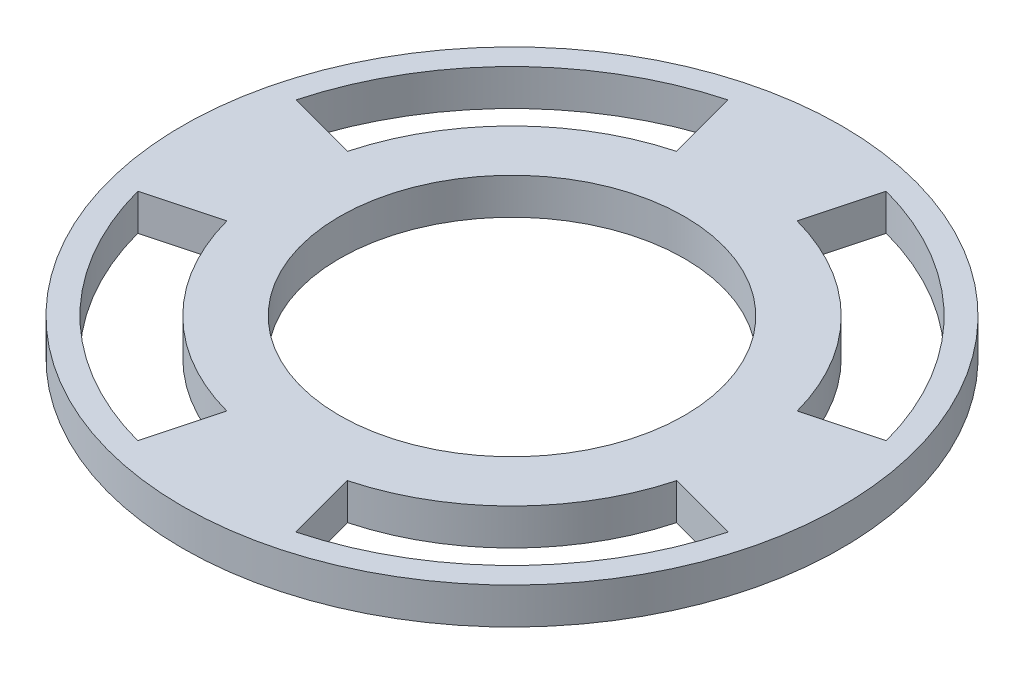
ISO-10303-21;
HEADER;
FILE_DESCRIPTION(('STEP AP214'),'2;1');
FILE_NAME('part.step','',(''),(''),'','','');
FILE_SCHEMA(('AUTOMOTIVE_DESIGN { 1 0 10303 214 1 1 1 1 }'));
ENDSEC;
DATA;
#1=APPLICATION_CONTEXT('core data for automotive mechanical design processes');
#2=APPLICATION_PROTOCOL_DEFINITION('international standard','automotive_design',2000,#1);
#3=PRODUCT_CONTEXT('',#1,'mechanical');
#4=PRODUCT('Part','Part','',(#3));
#5=PRODUCT_RELATED_PRODUCT_CATEGORY('part','',(#4));
#6=PRODUCT_DEFINITION_FORMATION('','',#4);
#7=PRODUCT_DEFINITION_CONTEXT('part definition',#1,'design');
#8=PRODUCT_DEFINITION('design','',#6,#7);
#9=PRODUCT_DEFINITION_SHAPE('','',#8);
#10=(LENGTH_UNIT() NAMED_UNIT(*) SI_UNIT(.MILLI.,.METRE.));
#11=(NAMED_UNIT(*) PLANE_ANGLE_UNIT() SI_UNIT($,.RADIAN.));
#12=(NAMED_UNIT(*) SI_UNIT($,.STERADIAN.) SOLID_ANGLE_UNIT());
#13=UNCERTAINTY_MEASURE_WITH_UNIT(LENGTH_MEASURE(1.E-05),#10,'distance_accuracy_value','');
#14=(GEOMETRIC_REPRESENTATION_CONTEXT(3) GLOBAL_UNCERTAINTY_ASSIGNED_CONTEXT((#13)) GLOBAL_UNIT_ASSIGNED_CONTEXT((#10,
#11,#12)) REPRESENTATION_CONTEXT('',''));
#15=CARTESIAN_POINT('',(0.,0.,0.));
#16=DIRECTION('',(0.,0.,1.));
#17=DIRECTION('',(1.,0.,0.));
#18=AXIS2_PLACEMENT_3D('',#15,#16,#17);
#19=CARTESIAN_POINT('',(0.,2.5,0.));
#20=DIRECTION('',(0.258819045102525,0.,-0.965925826289067));
#21=DIRECTION('',(-0.965925826289067,0.,-0.258819045102525));
#22=AXIS2_PLACEMENT_3D('',#19,#20,#21);
#23=PLANE('',#22);
#24=DIRECTION('',(0.965925826289067,0.,0.258819045102525));
#25=VECTOR('',#24,1.);
#26=CARTESIAN_POINT('',(0.,0.,0.));
#27=LINE('',#26,#25);
#28=CARTESIAN_POINT('',(15.4548132206251,0.,4.1411047216404));
#29=VERTEX_POINT('',#28);
#30=CARTESIAN_POINT('',(20.2844423520704,0.,5.43519994715302));
#31=VERTEX_POINT('',#30);
#32=EDGE_CURVE('E247',#29,#31,#27,.T.);
#33=ORIENTED_EDGE('',*,*,#32,.T.);
#34=DIRECTION('',(0.,-1.,0.));
#35=VECTOR('',#34,1.);
#36=CARTESIAN_POINT('',(20.2844423520704,2.5,5.43519994715302));
#37=LINE('',#36,#35);
#38=CARTESIAN_POINT('',(20.2844423520704,2.5,5.43519994715302));
#39=VERTEX_POINT('',#38);
#40=EDGE_CURVE('E11',#39,#31,#37,.T.);
#41=ORIENTED_EDGE('',*,*,#40,.F.);
#42=DIRECTION('',(0.965925826289067,0.,0.258819045102525));
#43=VECTOR('',#42,1.);
#44=CARTESIAN_POINT('',(0.,2.5,0.));
#45=LINE('',#44,#43);
#46=CARTESIAN_POINT('',(15.4548132206251,2.5,4.1411047216404));
#47=VERTEX_POINT('',#46);
#48=EDGE_CURVE('E180',#47,#39,#45,.T.);
#49=ORIENTED_EDGE('',*,*,#48,.F.);
#50=DIRECTION('',(0.,-1.,0.));
#51=VECTOR('',#50,1.);
#52=CARTESIAN_POINT('',(15.4548132206251,2.5,4.1411047216404));
#53=LINE('',#52,#51);
#54=EDGE_CURVE('E259',#47,#29,#53,.T.);
#55=ORIENTED_EDGE('',*,*,#54,.T.);
#56=EDGE_LOOP('',(#33,#41,#49,#55));
#57=FACE_BOUND('',#56,.T.);
#58=ADVANCED_FACE('F45',(#57),#23,.F.);
#59=CARTESIAN_POINT('',(0.,2.5,0.));
#60=DIRECTION('',(0.,-1.,0.));
#61=DIRECTION('',(0.,0.,-1.));
#62=AXIS2_PLACEMENT_3D('',#59,#60,#61);
#63=CYLINDRICAL_SURFACE('',#62,21.);
#64=CARTESIAN_POINT('',(0.,0.,0.));
#65=DIRECTION('',(0.,1.,0.));
#66=DIRECTION('',(0.,0.,1.));
#67=AXIS2_PLACEMENT_3D('',#64,#65,#66);
#68=CIRCLE('',#67,21.);
#69=CARTESIAN_POINT('',(5.43519994715281,0.,20.2844423520705));
#70=VERTEX_POINT('',#69);
#71=EDGE_CURVE('E170',#70,#31,#68,.T.);
#72=ORIENTED_EDGE('',*,*,#71,.F.);
#73=DIRECTION('',(0.,-1.,0.));
#74=VECTOR('',#73,1.);
#75=CARTESIAN_POINT('',(5.43519994715281,2.5,20.2844423520705));
#76=LINE('',#75,#74);
#77=CARTESIAN_POINT('',(5.43519994715281,2.5,20.2844423520705));
#78=VERTEX_POINT('',#77);
#79=EDGE_CURVE('E56',#78,#70,#76,.T.);
#80=ORIENTED_EDGE('',*,*,#79,.F.);
#81=CARTESIAN_POINT('',(0.,2.5,0.));
#82=DIRECTION('',(0.,1.,0.));
#83=DIRECTION('',(0.,0.,1.));
#84=AXIS2_PLACEMENT_3D('',#81,#82,#83);
#85=CIRCLE('',#84,21.);
#86=EDGE_CURVE('E168',#78,#39,#85,.T.);
#87=ORIENTED_EDGE('',*,*,#86,.T.);
#88=ORIENTED_EDGE('',*,*,#40,.T.);
#89=EDGE_LOOP('',(#72,#80,#87,#88));
#90=FACE_BOUND('',#89,.T.);
#91=ADVANCED_FACE('F167',(#90),#63,.F.);
#92=CARTESIAN_POINT('',(0.,2.5,0.));
#93=DIRECTION('',(0.96592582628907,0.,-0.258819045102515));
#94=DIRECTION('',(-0.258819045102515,0.,-0.96592582628907));
#95=AXIS2_PLACEMENT_3D('',#92,#93,#94);
#96=PLANE('',#95);
#97=DIRECTION('',(0.258819045102515,0.,0.96592582628907));
#98=VECTOR('',#97,1.);
#99=CARTESIAN_POINT('',(0.,0.,0.));
#100=LINE('',#99,#98);
#101=CARTESIAN_POINT('',(4.14110472164024,0.,15.4548132206251));
#102=VERTEX_POINT('',#101);
#103=EDGE_CURVE('E253',#102,#70,#100,.T.);
#104=ORIENTED_EDGE('',*,*,#103,.F.);
#105=DIRECTION('',(0.,-1.,0.));
#106=VECTOR('',#105,1.);
#107=CARTESIAN_POINT('',(4.14110472164024,2.5,15.4548132206251));
#108=LINE('',#107,#106);
#109=CARTESIAN_POINT('',(4.14110472164024,2.5,15.4548132206251));
#110=VERTEX_POINT('',#109);
#111=EDGE_CURVE('E116',#110,#102,#108,.T.);
#112=ORIENTED_EDGE('',*,*,#111,.F.);
#113=DIRECTION('',(0.258819045102515,0.,0.96592582628907));
#114=VECTOR('',#113,1.);
#115=CARTESIAN_POINT('',(0.,2.5,0.));
#116=LINE('',#115,#114);
#117=EDGE_CURVE('E178',#110,#78,#116,.T.);
#118=ORIENTED_EDGE('',*,*,#117,.T.);
#119=ORIENTED_EDGE('',*,*,#79,.T.);
#120=EDGE_LOOP('',(#104,#112,#118,#119));
#121=FACE_BOUND('',#120,.T.);
#122=ADVANCED_FACE('F184',(#121),#96,.T.);
#123=CARTESIAN_POINT('',(0.,2.5,0.));
#124=DIRECTION('',(0.,-1.,0.));
#125=DIRECTION('',(0.,0.,-1.));
#126=AXIS2_PLACEMENT_3D('',#123,#124,#125);
#127=CYLINDRICAL_SURFACE('',#126,21.);
#128=CARTESIAN_POINT('',(0.,0.,0.));
#129=DIRECTION('',(0.,1.,0.));
#130=DIRECTION('',(0.,0.,1.));
#131=AXIS2_PLACEMENT_3D('',#128,#129,#130);
#132=CIRCLE('',#131,21.);
#133=CARTESIAN_POINT('',(-20.2844423520705,0.,5.43519994715274));
#134=VERTEX_POINT('',#133);
#135=CARTESIAN_POINT('',(-5.43519994715309,0.,20.2844423520704));
#136=VERTEX_POINT('',#135);
#137=EDGE_CURVE('E227',#134,#136,#132,.T.);
#138=ORIENTED_EDGE('',*,*,#137,.F.);
#139=DIRECTION('',(0.,-1.,0.));
#140=VECTOR('',#139,1.);
#141=CARTESIAN_POINT('',(-20.2844423520705,2.5,5.43519994715274));
#142=LINE('',#141,#140);
#143=CARTESIAN_POINT('',(-20.2844423520705,2.5,5.43519994715274));
#144=VERTEX_POINT('',#143);
#145=EDGE_CURVE('E262',#144,#134,#142,.T.);
#146=ORIENTED_EDGE('',*,*,#145,.F.);
#147=CARTESIAN_POINT('',(0.,2.5,0.));
#148=DIRECTION('',(0.,1.,0.));
#149=DIRECTION('',(0.,0.,1.));
#150=AXIS2_PLACEMENT_3D('',#147,#148,#149);
#151=CIRCLE('',#150,21.);
#152=CARTESIAN_POINT('',(-5.43519994715309,2.5,20.2844423520704));
#153=VERTEX_POINT('',#152);
#154=EDGE_CURVE('E344',#144,#153,#151,.T.);
#155=ORIENTED_EDGE('',*,*,#154,.T.);
#156=DIRECTION('',(0.,-1.,0.));
#157=VECTOR('',#156,1.);
#158=CARTESIAN_POINT('',(-5.43519994715309,2.5,20.2844423520704));
#159=LINE('',#158,#157);
#160=EDGE_CURVE('E265',#153,#136,#159,.T.);
#161=ORIENTED_EDGE('',*,*,#160,.T.);
#162=EDGE_LOOP('',(#138,#146,#155,#161));
#163=FACE_BOUND('',#162,.T.);
#164=ADVANCED_FACE('F404',(#163),#127,.F.);
#165=CARTESIAN_POINT('',(0.,2.5,0.));
#166=DIRECTION('',(0.258819045102511,0.,0.965925826289071));
#167=DIRECTION('',(0.965925826289071,0.,-0.258819045102511));
#168=AXIS2_PLACEMENT_3D('',#165,#166,#167);
#169=PLANE('',#168);
#170=DIRECTION('',(-0.965925826289071,0.,0.258819045102511));
#171=VECTOR('',#170,1.);
#172=CARTESIAN_POINT('',(0.,0.,0.));
#173=LINE('',#172,#171);
#174=CARTESIAN_POINT('',(-15.4548132206251,0.,4.14110472164018));
#175=VERTEX_POINT('',#174);
#176=EDGE_CURVE('E231',#175,#134,#173,.T.);
#177=ORIENTED_EDGE('',*,*,#176,.F.);
#178=DIRECTION('',(0.,-1.,0.));
#179=VECTOR('',#178,1.);
#180=CARTESIAN_POINT('',(-15.4548132206251,2.5,4.14110472164018));
#181=LINE('',#180,#179);
#182=CARTESIAN_POINT('',(-15.4548132206251,2.5,4.14110472164018));
#183=VERTEX_POINT('',#182);
#184=EDGE_CURVE('E273',#183,#175,#181,.T.);
#185=ORIENTED_EDGE('',*,*,#184,.F.);
#186=DIRECTION('',(-0.965925826289071,0.,0.258819045102511));
#187=VECTOR('',#186,1.);
#188=CARTESIAN_POINT('',(0.,2.5,0.));
#189=LINE('',#188,#187);
#190=EDGE_CURVE('E348',#183,#144,#189,.T.);
#191=ORIENTED_EDGE('',*,*,#190,.T.);
#192=ORIENTED_EDGE('',*,*,#145,.T.);
#193=EDGE_LOOP('',(#177,#185,#191,#192));
#194=FACE_BOUND('',#193,.T.);
#195=ADVANCED_FACE('F400',(#194),#169,.T.);
#196=CARTESIAN_POINT('',(0.,2.5,0.));
#197=DIRECTION('',(0.,-1.,0.));
#198=DIRECTION('',(0.,0.,-1.));
#199=AXIS2_PLACEMENT_3D('',#196,#197,#198);
#200=CYLINDRICAL_SURFACE('',#199,16.);
#201=CARTESIAN_POINT('',(0.,0.,0.));
#202=DIRECTION('',(0.,1.,0.));
#203=DIRECTION('',(0.,0.,1.));
#204=AXIS2_PLACEMENT_3D('',#201,#202,#203);
#205=CIRCLE('',#204,16.);
#206=CARTESIAN_POINT('',(-4.14110472164045,0.,15.4548132206251));
#207=VERTEX_POINT('',#206);
#208=EDGE_CURVE('E235',#175,#207,#205,.T.);
#209=ORIENTED_EDGE('',*,*,#208,.T.);
#210=DIRECTION('',(0.,-1.,0.));
#211=VECTOR('',#210,1.);
#212=CARTESIAN_POINT('',(-4.14110472164045,2.5,15.4548132206251));
#213=LINE('',#212,#211);
#214=CARTESIAN_POINT('',(-4.14110472164045,2.5,15.4548132206251));
#215=VERTEX_POINT('',#214);
#216=EDGE_CURVE('E268',#215,#207,#213,.T.);
#217=ORIENTED_EDGE('',*,*,#216,.F.);
#218=CARTESIAN_POINT('',(0.,2.5,0.));
#219=DIRECTION('',(0.,1.,0.));
#220=DIRECTION('',(0.,0.,1.));
#221=AXIS2_PLACEMENT_3D('',#218,#219,#220);
#222=CIRCLE('',#221,16.);
#223=EDGE_CURVE('E352',#183,#215,#222,.T.);
#224=ORIENTED_EDGE('',*,*,#223,.F.);
#225=ORIENTED_EDGE('',*,*,#184,.T.);
#226=EDGE_LOOP('',(#209,#217,#224,#225));
#227=FACE_BOUND('',#226,.T.);
#228=ADVANCED_FACE('F396',(#227),#200,.T.);
#229=CARTESIAN_POINT('',(0.,2.5,0.));
#230=DIRECTION('',(-0.965925826289068,0.,-0.258819045102521));
#231=DIRECTION('',(-0.258819045102521,0.,0.965925826289068));
#232=AXIS2_PLACEMENT_3D('',#229,#230,#231);
#233=PLANE('',#232);
#234=DIRECTION('',(0.258819045102521,0.,-0.965925826289068));
#235=VECTOR('',#234,1.);
#236=CARTESIAN_POINT('',(0.,0.,0.));
#237=LINE('',#236,#235);
#238=CARTESIAN_POINT('',(4.14110472164034,0.,-15.4548132206251));
#239=VERTEX_POINT('',#238);
#240=CARTESIAN_POINT('',(5.43519994715295,0.,-20.2844423520704));
#241=VERTEX_POINT('',#240);
#242=EDGE_CURVE('E212',#239,#241,#237,.T.);
#243=ORIENTED_EDGE('',*,*,#242,.T.);
#244=DIRECTION('',(0.,-1.,0.));
#245=VECTOR('',#244,1.);
#246=CARTESIAN_POINT('',(5.43519994715295,2.5,-20.2844423520704));
#247=LINE('',#246,#245);
#248=CARTESIAN_POINT('',(5.43519994715295,2.5,-20.2844423520704));
#249=VERTEX_POINT('',#248);
#250=EDGE_CURVE('E269',#249,#241,#247,.T.);
#251=ORIENTED_EDGE('',*,*,#250,.F.);
#252=DIRECTION('',(0.258819045102521,0.,-0.965925826289068));
#253=VECTOR('',#252,1.);
#254=CARTESIAN_POINT('',(0.,2.5,0.));
#255=LINE('',#254,#253);
#256=CARTESIAN_POINT('',(4.14110472164034,2.5,-15.4548132206251));
#257=VERTEX_POINT('',#256);
#258=EDGE_CURVE('E321',#257,#249,#255,.T.);
#259=ORIENTED_EDGE('',*,*,#258,.F.);
#260=DIRECTION('',(0.,-1.,0.));
#261=VECTOR('',#260,1.);
#262=CARTESIAN_POINT('',(4.14110472164034,2.5,-15.4548132206251));
#263=LINE('',#262,#261);
#264=EDGE_CURVE('E278',#257,#239,#263,.T.);
#265=ORIENTED_EDGE('',*,*,#264,.T.);
#266=EDGE_LOOP('',(#243,#251,#259,#265));
#267=FACE_BOUND('',#266,.T.);
#268=ADVANCED_FACE('F399',(#267),#233,.F.);
#269=CARTESIAN_POINT('',(0.,2.5,0.));
#270=DIRECTION('',(0.,-1.,0.));
#271=DIRECTION('',(0.,0.,-1.));
#272=AXIS2_PLACEMENT_3D('',#269,#270,#271);
#273=CYLINDRICAL_SURFACE('',#272,21.);
#274=CARTESIAN_POINT('',(0.,0.,0.));
#275=DIRECTION('',(0.,1.,0.));
#276=DIRECTION('',(0.,0.,1.));
#277=AXIS2_PLACEMENT_3D('',#274,#275,#276);
#278=CIRCLE('',#277,21.);
#279=CARTESIAN_POINT('',(20.2844423520704,0.,-5.43519994715288));
#280=VERTEX_POINT('',#279);
#281=EDGE_CURVE('E216',#280,#241,#278,.T.);
#282=ORIENTED_EDGE('',*,*,#281,.F.);
#283=DIRECTION('',(0.,-1.,0.));
#284=VECTOR('',#283,1.);
#285=CARTESIAN_POINT('',(20.2844423520704,2.5,-5.43519994715288));
#286=LINE('',#285,#284);
#287=CARTESIAN_POINT('',(20.2844423520704,2.5,-5.43519994715288));
#288=VERTEX_POINT('',#287);
#289=EDGE_CURVE('E285',#288,#280,#286,.T.);
#290=ORIENTED_EDGE('',*,*,#289,.F.);
#291=CARTESIAN_POINT('',(0.,2.5,0.));
#292=DIRECTION('',(0.,1.,0.));
#293=DIRECTION('',(0.,0.,1.));
#294=AXIS2_PLACEMENT_3D('',#291,#292,#293);
#295=CIRCLE('',#294,21.);
#296=EDGE_CURVE('E333',#288,#249,#295,.T.);
#297=ORIENTED_EDGE('',*,*,#296,.T.);
#298=ORIENTED_EDGE('',*,*,#250,.T.);
#299=EDGE_LOOP('',(#282,#290,#297,#298));
#300=FACE_BOUND('',#299,.T.);
#301=ADVANCED_FACE('F415',(#300),#273,.F.);
#302=CARTESIAN_POINT('',(0.,2.5,0.));
#303=DIRECTION('',(-0.258819045102518,0.,-0.965925826289069));
#304=DIRECTION('',(-0.965925826289069,0.,0.258819045102518));
#305=AXIS2_PLACEMENT_3D('',#302,#303,#304);
#306=PLANE('',#305);
#307=DIRECTION('',(0.965925826289069,0.,-0.258819045102518));
#308=VECTOR('',#307,1.);
#309=CARTESIAN_POINT('',(0.,0.,0.));
#310=LINE('',#309,#308);
#311=CARTESIAN_POINT('',(15.4548132206251,0.,-4.14110472164029));
#312=VERTEX_POINT('',#311);
#313=EDGE_CURVE('E220',#312,#280,#310,.T.);
#314=ORIENTED_EDGE('',*,*,#313,.F.);
#315=DIRECTION('',(0.,-1.,0.));
#316=VECTOR('',#315,1.);
#317=CARTESIAN_POINT('',(15.4548132206251,2.5,-4.14110472164029));
#318=LINE('',#317,#316);
#319=CARTESIAN_POINT('',(15.4548132206251,2.5,-4.14110472164029));
#320=VERTEX_POINT('',#319);
#321=EDGE_CURVE('E282',#320,#312,#318,.T.);
#322=ORIENTED_EDGE('',*,*,#321,.F.);
#323=DIRECTION('',(0.965925826289069,0.,-0.258819045102518));
#324=VECTOR('',#323,1.);
#325=CARTESIAN_POINT('',(0.,2.5,0.));
#326=LINE('',#325,#324);
#327=EDGE_CURVE('E337',#320,#288,#326,.T.);
#328=ORIENTED_EDGE('',*,*,#327,.T.);
#329=ORIENTED_EDGE('',*,*,#289,.T.);
#330=EDGE_LOOP('',(#314,#322,#328,#329));
#331=FACE_BOUND('',#330,.T.);
#332=ADVANCED_FACE('F412',(#331),#306,.T.);
#333=CARTESIAN_POINT('',(0.,2.5,0.));
#334=DIRECTION('',(0.,-1.,0.));
#335=DIRECTION('',(0.,0.,-1.));
#336=AXIS2_PLACEMENT_3D('',#333,#334,#335);
#337=CYLINDRICAL_SURFACE('',#336,21.);
#338=CARTESIAN_POINT('',(0.,0.,0.));
#339=DIRECTION('',(0.,1.,0.));
#340=DIRECTION('',(0.,0.,1.));
#341=AXIS2_PLACEMENT_3D('',#338,#339,#340);
#342=CIRCLE('',#341,21.);
#343=CARTESIAN_POINT('',(-5.43519994715295,0.,-20.2844423520704));
#344=VERTEX_POINT('',#343);
#345=CARTESIAN_POINT('',(-20.2844423520704,0.,-5.43519994715316));
#346=VERTEX_POINT('',#345);
#347=EDGE_CURVE('E196',#344,#346,#342,.T.);
#348=ORIENTED_EDGE('',*,*,#347,.F.);
#349=DIRECTION('',(0.,-1.,0.));
#350=VECTOR('',#349,1.);
#351=CARTESIAN_POINT('',(-5.43519994715295,2.5,-20.2844423520704));
#352=LINE('',#351,#350);
#353=CARTESIAN_POINT('',(-5.43519994715295,2.5,-20.2844423520704));
#354=VERTEX_POINT('',#353);
#355=EDGE_CURVE('E49',#354,#344,#352,.T.);
#356=ORIENTED_EDGE('',*,*,#355,.F.);
#357=CARTESIAN_POINT('',(0.,2.5,0.));
#358=DIRECTION('',(0.,1.,0.));
#359=DIRECTION('',(0.,0.,1.));
#360=AXIS2_PLACEMENT_3D('',#357,#358,#359);
#361=CIRCLE('',#360,21.);
#362=CARTESIAN_POINT('',(-20.2844423520704,2.5,-5.43519994715316));
#363=VERTEX_POINT('',#362);
#364=EDGE_CURVE('E327',#354,#363,#361,.T.);
#365=ORIENTED_EDGE('',*,*,#364,.T.);
#366=DIRECTION('',(0.,-1.,0.));
#367=VECTOR('',#366,1.);
#368=CARTESIAN_POINT('',(-20.2844423520704,2.5,-5.43519994715316));
#369=LINE('',#368,#367);
#370=EDGE_CURVE('E188',#363,#346,#369,.T.);
#371=ORIENTED_EDGE('',*,*,#370,.T.);
#372=EDGE_LOOP('',(#348,#356,#365,#371));
#373=FACE_BOUND('',#372,.T.);
#374=ADVANCED_FACE('F307',(#373),#337,.F.);
#375=CARTESIAN_POINT('',(0.,2.5,0.));
#376=DIRECTION('',(-0.965925826289068,0.,0.258819045102522));
#377=DIRECTION('',(0.258819045102522,0.,0.965925826289068));
#378=AXIS2_PLACEMENT_3D('',#375,#376,#377);
#379=PLANE('',#378);
#380=DIRECTION('',(-0.258819045102522,0.,-0.965925826289068));
#381=VECTOR('',#380,1.);
#382=CARTESIAN_POINT('',(0.,0.,0.));
#383=LINE('',#382,#381);
#384=CARTESIAN_POINT('',(-4.14110472164034,0.,-15.4548132206251));
#385=VERTEX_POINT('',#384);
#386=EDGE_CURVE('E200',#385,#344,#383,.T.);
#387=ORIENTED_EDGE('',*,*,#386,.F.);
#388=DIRECTION('',(0.,-1.,0.));
#389=VECTOR('',#388,1.);
#390=CARTESIAN_POINT('',(-4.14110472164034,2.5,-15.4548132206251));
#391=LINE('',#390,#389);
#392=CARTESIAN_POINT('',(-4.14110472164034,2.5,-15.4548132206251));
#393=VERTEX_POINT('',#392);
#394=EDGE_CURVE('E295',#393,#385,#391,.T.);
#395=ORIENTED_EDGE('',*,*,#394,.F.);
#396=DIRECTION('',(-0.258819045102522,0.,-0.965925826289068));
#397=VECTOR('',#396,1.);
#398=CARTESIAN_POINT('',(0.,2.5,0.));
#399=LINE('',#398,#397);
#400=EDGE_CURVE('E306',#393,#354,#399,.T.);
#401=ORIENTED_EDGE('',*,*,#400,.T.);
#402=ORIENTED_EDGE('',*,*,#355,.T.);
#403=EDGE_LOOP('',(#387,#395,#401,#402));
#404=FACE_BOUND('',#403,.T.);
#405=ADVANCED_FACE('F304',(#404),#379,.T.);
#406=CARTESIAN_POINT('',(0.,2.5,0.));
#407=DIRECTION('',(0.,-1.,0.));
#408=DIRECTION('',(0.,0.,-1.));
#409=AXIS2_PLACEMENT_3D('',#406,#407,#408);
#410=CYLINDRICAL_SURFACE('',#409,16.);
#411=CARTESIAN_POINT('',(0.,0.,0.));
#412=DIRECTION('',(0.,1.,0.));
#413=DIRECTION('',(0.,0.,1.));
#414=AXIS2_PLACEMENT_3D('',#411,#412,#413);
#415=CIRCLE('',#414,16.);
#416=CARTESIAN_POINT('',(-15.454813220625,0.,-4.1411047216405));
#417=VERTEX_POINT('',#416);
#418=EDGE_CURVE('E204',#385,#417,#415,.T.);
#419=ORIENTED_EDGE('',*,*,#418,.T.);
#420=DIRECTION('',(0.,-1.,0.));
#421=VECTOR('',#420,1.);
#422=CARTESIAN_POINT('',(-15.454813220625,2.5,-4.1411047216405));
#423=LINE('',#422,#421);
#424=CARTESIAN_POINT('',(-15.454813220625,2.5,-4.1411047216405));
#425=VERTEX_POINT('',#424);
#426=EDGE_CURVE('E292',#425,#417,#423,.T.);
#427=ORIENTED_EDGE('',*,*,#426,.F.);
#428=CARTESIAN_POINT('',(0.,2.5,0.));
#429=DIRECTION('',(0.,1.,0.));
#430=DIRECTION('',(0.,0.,1.));
#431=AXIS2_PLACEMENT_3D('',#428,#429,#430);
#432=CIRCLE('',#431,16.);
#433=EDGE_CURVE('E315',#393,#425,#432,.T.);
#434=ORIENTED_EDGE('',*,*,#433,.F.);
#435=ORIENTED_EDGE('',*,*,#394,.T.);
#436=EDGE_LOOP('',(#419,#427,#434,#435));
#437=FACE_BOUND('',#436,.T.);
#438=ADVANCED_FACE('F313',(#437),#410,.T.);
#439=CARTESIAN_POINT('',(0.,2.5,0.));
#440=DIRECTION('',(0.,-1.,0.));
#441=DIRECTION('',(0.,0.,-1.));
#442=AXIS2_PLACEMENT_3D('',#439,#440,#441);
#443=CYLINDRICAL_SURFACE('',#442,11.85);
#444=CARTESIAN_POINT('',(0.,2.5,0.));
#445=DIRECTION('',(0.,1.,0.));
#446=DIRECTION('',(0.,0.,1.));
#447=AXIS2_PLACEMENT_3D('',#444,#445,#446);
#448=CIRCLE('',#447,11.85);
#449=CARTESIAN_POINT('',(0.,2.5,11.85));
#450=VERTEX_POINT('',#449);
#451=EDGE_CURVE('E359',#450,#450,#448,.T.);
#452=ORIENTED_EDGE('',*,*,#451,.T.);
#453=EDGE_LOOP('',(#452));
#454=FACE_BOUND('',#453,.T.);
#455=CARTESIAN_POINT('',(0.,0.,0.));
#456=DIRECTION('',(0.,1.,0.));
#457=DIRECTION('',(0.,0.,1.));
#458=AXIS2_PLACEMENT_3D('',#455,#456,#457);
#459=CIRCLE('',#458,11.85);
#460=CARTESIAN_POINT('',(0.,0.,11.85));
#461=VERTEX_POINT('',#460);
#462=EDGE_CURVE('E243',#461,#461,#459,.T.);
#463=ORIENTED_EDGE('',*,*,#462,.F.);
#464=EDGE_LOOP('',(#463));
#465=FACE_BOUND('',#464,.T.);
#466=ADVANCED_FACE('F365',(#454,#465),#443,.F.);
#467=CARTESIAN_POINT('',(0.,2.5,0.));
#468=DIRECTION('',(0.965925826289066,0.,0.258819045102528));
#469=DIRECTION('',(0.258819045102528,0.,-0.965925826289066));
#470=AXIS2_PLACEMENT_3D('',#467,#468,#469);
#471=PLANE('',#470);
#472=DIRECTION('',(-0.258819045102528,0.,0.965925826289066));
#473=VECTOR('',#472,1.);
#474=CARTESIAN_POINT('',(0.,0.,0.));
#475=LINE('',#474,#473);
#476=EDGE_CURVE('E239',#207,#136,#475,.T.);
#477=ORIENTED_EDGE('',*,*,#476,.T.);
#478=ORIENTED_EDGE('',*,*,#160,.F.);
#479=DIRECTION('',(-0.258819045102528,0.,0.965925826289066));
#480=VECTOR('',#479,1.);
#481=CARTESIAN_POINT('',(0.,2.5,0.));
#482=LINE('',#481,#480);
#483=EDGE_CURVE('E356',#215,#153,#482,.T.);
#484=ORIENTED_EDGE('',*,*,#483,.F.);
#485=ORIENTED_EDGE('',*,*,#216,.T.);
#486=EDGE_LOOP('',(#477,#478,#484,#485));
#487=FACE_BOUND('',#486,.T.);
#488=ADVANCED_FACE('F391',(#487),#471,.F.);
#489=CARTESIAN_POINT('',(0.,2.5,0.));
#490=DIRECTION('',(0.,-1.,0.));
#491=DIRECTION('',(0.,0.,-1.));
#492=AXIS2_PLACEMENT_3D('',#489,#490,#491);
#493=CYLINDRICAL_SURFACE('',#492,16.);
#494=CARTESIAN_POINT('',(0.,0.,0.));
#495=DIRECTION('',(0.,1.,0.));
#496=DIRECTION('',(0.,0.,1.));
#497=AXIS2_PLACEMENT_3D('',#494,#495,#496);
#498=CIRCLE('',#497,16.);
#499=EDGE_CURVE('E224',#312,#239,#498,.T.);
#500=ORIENTED_EDGE('',*,*,#499,.T.);
#501=ORIENTED_EDGE('',*,*,#264,.F.);
#502=CARTESIAN_POINT('',(0.,2.5,0.));
#503=DIRECTION('',(0.,1.,0.));
#504=DIRECTION('',(0.,0.,1.));
#505=AXIS2_PLACEMENT_3D('',#502,#503,#504);
#506=CIRCLE('',#505,16.);
#507=EDGE_CURVE('E341',#320,#257,#506,.T.);
#508=ORIENTED_EDGE('',*,*,#507,.F.);
#509=ORIENTED_EDGE('',*,*,#321,.T.);
#510=EDGE_LOOP('',(#500,#501,#508,#509));
#511=FACE_BOUND('',#510,.T.);
#512=ADVANCED_FACE('F394',(#511),#493,.T.);
#513=CARTESIAN_POINT('',(0.,2.5,0.));
#514=DIRECTION('',(-0.258819045102531,0.,0.965925826289065));
#515=DIRECTION('',(0.965925826289065,0.,0.258819045102531));
#516=AXIS2_PLACEMENT_3D('',#513,#514,#515);
#517=PLANE('',#516);
#518=DIRECTION('',(-0.965925826289065,0.,-0.258819045102531));
#519=VECTOR('',#518,1.);
#520=CARTESIAN_POINT('',(0.,0.,0.));
#521=LINE('',#520,#519);
#522=EDGE_CURVE('E208',#417,#346,#521,.T.);
#523=ORIENTED_EDGE('',*,*,#522,.T.);
#524=ORIENTED_EDGE('',*,*,#370,.F.);
#525=DIRECTION('',(-0.965925826289065,0.,-0.258819045102531));
#526=VECTOR('',#525,1.);
#527=CARTESIAN_POINT('',(0.,2.5,0.));
#528=LINE('',#527,#526);
#529=EDGE_CURVE('E318',#425,#363,#528,.T.);
#530=ORIENTED_EDGE('',*,*,#529,.F.);
#531=ORIENTED_EDGE('',*,*,#426,.T.);
#532=EDGE_LOOP('',(#523,#524,#530,#531));
#533=FACE_BOUND('',#532,.T.);
#534=ADVANCED_FACE('F317',(#533),#517,.F.);
#535=CARTESIAN_POINT('',(0.,2.5,0.));
#536=DIRECTION('',(0.,-1.,0.));
#537=DIRECTION('',(0.,0.,-1.));
#538=AXIS2_PLACEMENT_3D('',#535,#536,#537);
#539=CYLINDRICAL_SURFACE('',#538,22.65);
#540=CARTESIAN_POINT('',(0.,2.5,0.));
#541=DIRECTION('',(0.,1.,0.));
#542=DIRECTION('',(0.,0.,1.));
#543=AXIS2_PLACEMENT_3D('',#540,#541,#542);
#544=CIRCLE('',#543,22.65);
#545=CARTESIAN_POINT('',(0.,2.5,22.65));
#546=VERTEX_POINT('',#545);
#547=EDGE_CURVE('E258',#546,#546,#544,.T.);
#548=ORIENTED_EDGE('',*,*,#547,.F.);
#549=EDGE_LOOP('',(#548));
#550=FACE_BOUND('',#549,.T.);
#551=CARTESIAN_POINT('',(0.,0.,0.));
#552=DIRECTION('',(0.,1.,0.));
#553=DIRECTION('',(0.,0.,1.));
#554=AXIS2_PLACEMENT_3D('',#551,#552,#553);
#555=CIRCLE('',#554,22.65);
#556=CARTESIAN_POINT('',(0.,0.,22.65));
#557=VERTEX_POINT('',#556);
#558=EDGE_CURVE('E192',#557,#557,#555,.T.);
#559=ORIENTED_EDGE('',*,*,#558,.T.);
#560=EDGE_LOOP('',(#559));
#561=FACE_BOUND('',#560,.T.);
#562=ADVANCED_FACE('F47',(#550,#561),#539,.T.);
#563=CARTESIAN_POINT('',(0.,2.5,0.));
#564=DIRECTION('',(0.,-1.,0.));
#565=DIRECTION('',(0.,0.,-1.));
#566=AXIS2_PLACEMENT_3D('',#563,#564,#565);
#567=CYLINDRICAL_SURFACE('',#566,16.);
#568=CARTESIAN_POINT('',(0.,0.,0.));
#569=DIRECTION('',(0.,1.,0.));
#570=DIRECTION('',(0.,0.,1.));
#571=AXIS2_PLACEMENT_3D('',#568,#569,#570);
#572=CIRCLE('',#571,16.);
#573=EDGE_CURVE('E119',#102,#29,#572,.T.);
#574=ORIENTED_EDGE('',*,*,#573,.T.);
#575=ORIENTED_EDGE('',*,*,#54,.F.);
#576=CARTESIAN_POINT('',(0.,2.5,0.));
#577=DIRECTION('',(0.,1.,0.));
#578=DIRECTION('',(0.,0.,1.));
#579=AXIS2_PLACEMENT_3D('',#576,#577,#578);
#580=CIRCLE('',#579,16.);
#581=EDGE_CURVE('E65',#110,#47,#580,.T.);
#582=ORIENTED_EDGE('',*,*,#581,.F.);
#583=ORIENTED_EDGE('',*,*,#111,.T.);
#584=EDGE_LOOP('',(#574,#575,#582,#583));
#585=FACE_BOUND('',#584,.T.);
#586=ADVANCED_FACE('F369',(#585),#567,.T.);
#587=CARTESIAN_POINT('',(0.,2.5,0.));
#588=DIRECTION('',(0.,1.,0.));
#589=DIRECTION('',(0.,0.,1.));
#590=AXIS2_PLACEMENT_3D('',#587,#588,#589);
#591=PLANE('',#590);
#592=ORIENTED_EDGE('',*,*,#547,.T.);
#593=EDGE_LOOP('',(#592));
#594=FACE_BOUND('',#593,.T.);
#595=ORIENTED_EDGE('',*,*,#364,.F.);
#596=ORIENTED_EDGE('',*,*,#400,.F.);
#597=ORIENTED_EDGE('',*,*,#433,.T.);
#598=ORIENTED_EDGE('',*,*,#529,.T.);
#599=EDGE_LOOP('',(#595,#596,#597,#598));
#600=FACE_BOUND('',#599,.T.);
#601=ORIENTED_EDGE('',*,*,#258,.T.);
#602=ORIENTED_EDGE('',*,*,#296,.F.);
#603=ORIENTED_EDGE('',*,*,#327,.F.);
#604=ORIENTED_EDGE('',*,*,#507,.T.);
#605=EDGE_LOOP('',(#601,#602,#603,#604));
#606=FACE_BOUND('',#605,.T.);
#607=ORIENTED_EDGE('',*,*,#154,.F.);
#608=ORIENTED_EDGE('',*,*,#190,.F.);
#609=ORIENTED_EDGE('',*,*,#223,.T.);
#610=ORIENTED_EDGE('',*,*,#483,.T.);
#611=EDGE_LOOP('',(#607,#608,#609,#610));
#612=FACE_BOUND('',#611,.T.);
#613=ORIENTED_EDGE('',*,*,#451,.F.);
#614=EDGE_LOOP('',(#613));
#615=FACE_BOUND('',#614,.T.);
#616=ORIENTED_EDGE('',*,*,#48,.T.);
#617=ORIENTED_EDGE('',*,*,#86,.F.);
#618=ORIENTED_EDGE('',*,*,#117,.F.);
#619=ORIENTED_EDGE('',*,*,#581,.T.);
#620=EDGE_LOOP('',(#616,#617,#618,#619));
#621=FACE_BOUND('',#620,.T.);
#622=ADVANCED_FACE('F177',(#594,#600,#606,#612,#615,#621),#591,.T.);
#623=CARTESIAN_POINT('',(0.,0.,0.));
#624=DIRECTION('',(0.,1.,0.));
#625=DIRECTION('',(0.,0.,1.));
#626=AXIS2_PLACEMENT_3D('',#623,#624,#625);
#627=PLANE('',#626);
#628=ORIENTED_EDGE('',*,*,#558,.F.);
#629=EDGE_LOOP('',(#628));
#630=FACE_BOUND('',#629,.T.);
#631=ORIENTED_EDGE('',*,*,#347,.T.);
#632=ORIENTED_EDGE('',*,*,#522,.F.);
#633=ORIENTED_EDGE('',*,*,#418,.F.);
#634=ORIENTED_EDGE('',*,*,#386,.T.);
#635=EDGE_LOOP('',(#631,#632,#633,#634));
#636=FACE_BOUND('',#635,.T.);
#637=ORIENTED_EDGE('',*,*,#242,.F.);
#638=ORIENTED_EDGE('',*,*,#499,.F.);
#639=ORIENTED_EDGE('',*,*,#313,.T.);
#640=ORIENTED_EDGE('',*,*,#281,.T.);
#641=EDGE_LOOP('',(#637,#638,#639,#640));
#642=FACE_BOUND('',#641,.T.);
#643=ORIENTED_EDGE('',*,*,#137,.T.);
#644=ORIENTED_EDGE('',*,*,#476,.F.);
#645=ORIENTED_EDGE('',*,*,#208,.F.);
#646=ORIENTED_EDGE('',*,*,#176,.T.);
#647=EDGE_LOOP('',(#643,#644,#645,#646));
#648=FACE_BOUND('',#647,.T.);
#649=ORIENTED_EDGE('',*,*,#462,.T.);
#650=EDGE_LOOP('',(#649));
#651=FACE_BOUND('',#650,.T.);
#652=ORIENTED_EDGE('',*,*,#32,.F.);
#653=ORIENTED_EDGE('',*,*,#573,.F.);
#654=ORIENTED_EDGE('',*,*,#103,.T.);
#655=ORIENTED_EDGE('',*,*,#71,.T.);
#656=EDGE_LOOP('',(#652,#653,#654,#655));
#657=FACE_BOUND('',#656,.T.);
#658=ADVANCED_FACE('F310',(#630,#636,#642,#648,#651,#657),#627,.F.);
#659=CLOSED_SHELL('',(#58,#91,#122,#164,#195,#228,#268,#301,#332,#374,#405,#438,#466,#488,#512,
#534,#562,#586,#622,#658));
#660=MANIFOLD_SOLID_BREP('B2',#659);
#661=ADVANCED_BREP_SHAPE_REPRESENTATION('',(#18,#660),#14);
#662=SHAPE_DEFINITION_REPRESENTATION(#9,#661);
ENDSEC;
END-ISO-10303-21;
